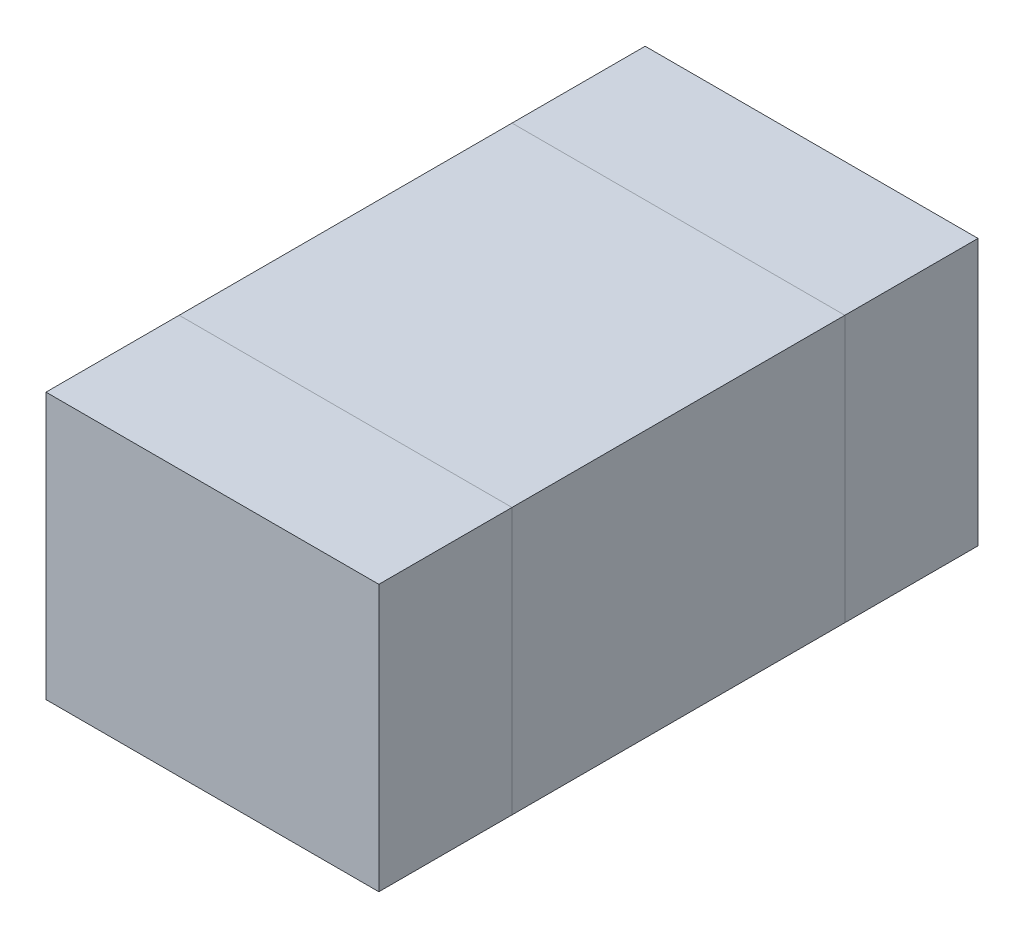
ISO-10303-21;
HEADER;
FILE_DESCRIPTION(('STEP AP214'),'2;1');
FILE_NAME('part.step','',(''),(''),'','','');
FILE_SCHEMA(('AUTOMOTIVE_DESIGN { 1 0 10303 214 1 1 1 1 }'));
ENDSEC;
DATA;
#1=APPLICATION_CONTEXT('core data for automotive mechanical design processes');
#2=APPLICATION_PROTOCOL_DEFINITION('international standard','automotive_design',2000,#1);
#3=PRODUCT_CONTEXT('',#1,'mechanical');
#4=PRODUCT('Part','Part','',(#3));
#5=PRODUCT_RELATED_PRODUCT_CATEGORY('part','',(#4));
#6=PRODUCT_DEFINITION_FORMATION('','',#4);
#7=PRODUCT_DEFINITION_CONTEXT('part definition',#1,'design');
#8=PRODUCT_DEFINITION('design','',#6,#7);
#9=PRODUCT_DEFINITION_SHAPE('','',#8);
#10=(LENGTH_UNIT() NAMED_UNIT(*) SI_UNIT(.MILLI.,.METRE.));
#11=(NAMED_UNIT(*) PLANE_ANGLE_UNIT() SI_UNIT($,.RADIAN.));
#12=(NAMED_UNIT(*) SI_UNIT($,.STERADIAN.) SOLID_ANGLE_UNIT());
#13=UNCERTAINTY_MEASURE_WITH_UNIT(LENGTH_MEASURE(1.E-05),#10,'distance_accuracy_value','');
#14=(GEOMETRIC_REPRESENTATION_CONTEXT(3) GLOBAL_UNCERTAINTY_ASSIGNED_CONTEXT((#13)) GLOBAL_UNIT_ASSIGNED_CONTEXT((#10,
#11,#12)) REPRESENTATION_CONTEXT('',''));
#15=CARTESIAN_POINT('',(0.,0.,0.));
#16=DIRECTION('',(0.,0.,1.));
#17=DIRECTION('',(1.,0.,0.));
#18=AXIS2_PLACEMENT_3D('',#15,#16,#17);
#19=CARTESIAN_POINT('',(0.,0.,0.));
#20=DIRECTION('',(0.,1.,0.));
#21=DIRECTION('',(1.,0.,0.));
#22=AXIS2_PLACEMENT_3D('',#19,#20,#21);
#23=PLANE('',#22);
#24=DIRECTION('',(0.,0.,-1.));
#25=VECTOR('',#24,1.);
#26=CARTESIAN_POINT('',(0.5,0.,-0.5));
#27=LINE('',#26,#25);
#28=CARTESIAN_POINT('',(0.5,0.,0.5));
#29=VERTEX_POINT('',#28);
#30=CARTESIAN_POINT('',(0.5,0.,-0.5));
#31=VERTEX_POINT('',#30);
#32=EDGE_CURVE('P0_E20',#29,#31,#27,.T.);
#33=ORIENTED_EDGE('',*,*,#32,.F.);
#34=DIRECTION('',(1.,0.,0.));
#35=VECTOR('',#34,1.);
#36=CARTESIAN_POINT('',(-0.5,0.,0.5));
#37=LINE('',#36,#35);
#38=CARTESIAN_POINT('',(-0.5,0.,0.5));
#39=VERTEX_POINT('',#38);
#40=EDGE_CURVE('P0_E27',#39,#29,#37,.T.);
#41=ORIENTED_EDGE('',*,*,#40,.F.);
#42=DIRECTION('',(0.,0.,1.));
#43=VECTOR('',#42,1.);
#44=CARTESIAN_POINT('',(-0.5,0.,-0.5));
#45=LINE('',#44,#43);
#46=CARTESIAN_POINT('',(-0.5,0.,-0.5));
#47=VERTEX_POINT('',#46);
#48=EDGE_CURVE('P0_E91',#47,#39,#45,.T.);
#49=ORIENTED_EDGE('',*,*,#48,.F.);
#50=DIRECTION('',(-1.,0.,0.));
#51=VECTOR('',#50,1.);
#52=CARTESIAN_POINT('',(-0.5,0.,-0.5));
#53=LINE('',#52,#51);
#54=EDGE_CURVE('P0_E93',#31,#47,#53,.T.);
#55=ORIENTED_EDGE('',*,*,#54,.F.);
#56=EDGE_LOOP('',(#33,#41,#49,#55));
#57=FACE_BOUND('',#56,.T.);
#58=ADVANCED_FACE('P0_F16',(#57),#23,.F.);
#59=CARTESIAN_POINT('',(0.,0.8,0.));
#60=DIRECTION('',(0.,1.,0.));
#61=DIRECTION('',(1.,0.,0.));
#62=AXIS2_PLACEMENT_3D('',#59,#60,#61);
#63=PLANE('',#62);
#64=DIRECTION('',(0.,0.,-1.));
#65=VECTOR('',#64,1.);
#66=CARTESIAN_POINT('',(0.5,0.8,-0.5));
#67=LINE('',#66,#65);
#68=CARTESIAN_POINT('',(0.5,0.8,0.5));
#69=VERTEX_POINT('',#68);
#70=CARTESIAN_POINT('',(0.5,0.8,-0.5));
#71=VERTEX_POINT('',#70);
#72=EDGE_CURVE('P0_E88',#69,#71,#67,.T.);
#73=ORIENTED_EDGE('',*,*,#72,.T.);
#74=DIRECTION('',(-1.,0.,0.));
#75=VECTOR('',#74,1.);
#76=CARTESIAN_POINT('',(-0.5,0.8,-0.5));
#77=LINE('',#76,#75);
#78=CARTESIAN_POINT('',(-0.5,0.8,-0.5));
#79=VERTEX_POINT('',#78);
#80=EDGE_CURVE('P0_E69',#71,#79,#77,.T.);
#81=ORIENTED_EDGE('',*,*,#80,.T.);
#82=DIRECTION('',(0.,0.,1.));
#83=VECTOR('',#82,1.);
#84=CARTESIAN_POINT('',(-0.5,0.8,-0.5));
#85=LINE('',#84,#83);
#86=CARTESIAN_POINT('',(-0.5,0.8,0.5));
#87=VERTEX_POINT('',#86);
#88=EDGE_CURVE('P0_E78',#79,#87,#85,.T.);
#89=ORIENTED_EDGE('',*,*,#88,.T.);
#90=DIRECTION('',(1.,0.,0.));
#91=VECTOR('',#90,1.);
#92=CARTESIAN_POINT('',(-0.5,0.8,0.5));
#93=LINE('',#92,#91);
#94=EDGE_CURVE('P0_E11',#87,#69,#93,.T.);
#95=ORIENTED_EDGE('',*,*,#94,.T.);
#96=EDGE_LOOP('',(#73,#81,#89,#95));
#97=FACE_BOUND('',#96,.T.);
#98=ADVANCED_FACE('P0_F86',(#97),#63,.T.);
#99=CARTESIAN_POINT('',(-0.5,0.8,0.5));
#100=DIRECTION('',(0.,0.,-1.));
#101=DIRECTION('',(0.,-1.,0.));
#102=AXIS2_PLACEMENT_3D('',#99,#100,#101);
#103=PLANE('',#102);
#104=ORIENTED_EDGE('',*,*,#40,.T.);
#105=DIRECTION('',(0.,-1.,0.));
#106=VECTOR('',#105,1.);
#107=CARTESIAN_POINT('',(0.5,0.8,0.5));
#108=LINE('',#107,#106);
#109=EDGE_CURVE('P0_E100',#69,#29,#108,.T.);
#110=ORIENTED_EDGE('',*,*,#109,.F.);
#111=ORIENTED_EDGE('',*,*,#94,.F.);
#112=DIRECTION('',(0.,-1.,0.));
#113=VECTOR('',#112,1.);
#114=CARTESIAN_POINT('',(-0.5,0.8,0.5));
#115=LINE('',#114,#113);
#116=EDGE_CURVE('P0_E83',#87,#39,#115,.T.);
#117=ORIENTED_EDGE('',*,*,#116,.T.);
#118=EDGE_LOOP('',(#104,#110,#111,#117));
#119=FACE_BOUND('',#118,.T.);
#120=ADVANCED_FACE('P0_F152',(#119),#103,.F.);
#121=CARTESIAN_POINT('',(-0.5,0.8,-0.5));
#122=DIRECTION('',(1.,0.,0.));
#123=DIRECTION('',(0.,0.,-1.));
#124=AXIS2_PLACEMENT_3D('',#121,#122,#123);
#125=PLANE('',#124);
#126=ORIENTED_EDGE('',*,*,#48,.T.);
#127=ORIENTED_EDGE('',*,*,#116,.F.);
#128=ORIENTED_EDGE('',*,*,#88,.F.);
#129=DIRECTION('',(0.,-1.,0.));
#130=VECTOR('',#129,1.);
#131=CARTESIAN_POINT('',(-0.5,0.8,-0.5));
#132=LINE('',#131,#130);
#133=EDGE_CURVE('P0_E81',#79,#47,#132,.T.);
#134=ORIENTED_EDGE('',*,*,#133,.T.);
#135=EDGE_LOOP('',(#126,#127,#128,#134));
#136=FACE_BOUND('',#135,.T.);
#137=ADVANCED_FACE('P0_F80',(#136),#125,.F.);
#138=CARTESIAN_POINT('',(-0.5,0.8,-0.5));
#139=DIRECTION('',(0.,0.,1.));
#140=DIRECTION('',(1.,0.,0.));
#141=AXIS2_PLACEMENT_3D('',#138,#139,#140);
#142=PLANE('',#141);
#143=ORIENTED_EDGE('',*,*,#54,.T.);
#144=ORIENTED_EDGE('',*,*,#133,.F.);
#145=ORIENTED_EDGE('',*,*,#80,.F.);
#146=DIRECTION('',(0.,-1.,0.));
#147=VECTOR('',#146,1.);
#148=CARTESIAN_POINT('',(0.5,0.8,-0.5));
#149=LINE('',#148,#147);
#150=EDGE_CURVE('P0_E108',#71,#31,#149,.T.);
#151=ORIENTED_EDGE('',*,*,#150,.T.);
#152=EDGE_LOOP('',(#143,#144,#145,#151));
#153=FACE_BOUND('',#152,.T.);
#154=ADVANCED_FACE('P0_F18',(#153),#142,.F.);
#155=CARTESIAN_POINT('',(0.5,0.8,-0.5));
#156=DIRECTION('',(-1.,0.,0.));
#157=DIRECTION('',(0.,1.,0.));
#158=AXIS2_PLACEMENT_3D('',#155,#156,#157);
#159=PLANE('',#158);
#160=ORIENTED_EDGE('',*,*,#32,.T.);
#161=ORIENTED_EDGE('',*,*,#150,.F.);
#162=ORIENTED_EDGE('',*,*,#72,.F.);
#163=ORIENTED_EDGE('',*,*,#109,.T.);
#164=EDGE_LOOP('',(#160,#161,#162,#163));
#165=FACE_BOUND('',#164,.T.);
#166=ADVANCED_FACE('P0_F162',(#165),#159,.F.);
#167=CLOSED_SHELL('',(#58,#98,#120,#137,#154,#166));
#168=MANIFOLD_SOLID_BREP('P0_B1',#167);
#169=CARTESIAN_POINT('',(-0.5,1.8770329614269,0.5));
#170=DIRECTION('',(-1.,0.,0.));
#171=DIRECTION('',(0.,1.,0.));
#172=AXIS2_PLACEMENT_3D('',#169,#170,#171);
#173=PLANE('',#172);
#174=DIRECTION('',(0.,-1.,0.));
#175=VECTOR('',#174,1.);
#176=CARTESIAN_POINT('',(-0.5,1.8770329614269,0.9));
#177=LINE('',#176,#175);
#178=CARTESIAN_POINT('',(-0.5,0.8,0.9));
#179=VERTEX_POINT('',#178);
#180=CARTESIAN_POINT('',(-0.5,0.,0.9));
#181=VERTEX_POINT('',#180);
#182=EDGE_CURVE('P1_E11',#179,#181,#177,.T.);
#183=ORIENTED_EDGE('',*,*,#182,.F.);
#184=DIRECTION('',(0.,0.,-1.));
#185=VECTOR('',#184,1.);
#186=CARTESIAN_POINT('',(-0.5,0.8,0.5));
#187=LINE('',#186,#185);
#188=CARTESIAN_POINT('',(-0.5,0.8,0.5));
#189=VERTEX_POINT('',#188);
#190=EDGE_CURVE('P1_E73',#179,#189,#187,.T.);
#191=ORIENTED_EDGE('',*,*,#190,.T.);
#192=DIRECTION('',(0.,-1.,0.));
#193=VECTOR('',#192,1.);
#194=CARTESIAN_POINT('',(-0.5,1.8770329614269,0.5));
#195=LINE('',#194,#193);
#196=CARTESIAN_POINT('',(-0.5,0.,0.5));
#197=VERTEX_POINT('',#196);
#198=EDGE_CURVE('P1_E68',#189,#197,#195,.T.);
#199=ORIENTED_EDGE('',*,*,#198,.T.);
#200=DIRECTION('',(0.,0.,-1.));
#201=VECTOR('',#200,1.);
#202=CARTESIAN_POINT('',(-0.5,0.,0.5));
#203=LINE('',#202,#201);
#204=EDGE_CURVE('P1_E71',#181,#197,#203,.T.);
#205=ORIENTED_EDGE('',*,*,#204,.F.);
#206=EDGE_LOOP('',(#183,#191,#199,#205));
#207=FACE_BOUND('',#206,.T.);
#208=ADVANCED_FACE('P1_F16',(#207),#173,.T.);
#209=CARTESIAN_POINT('',(-0.5,1.8770329614269,0.9));
#210=DIRECTION('',(0.,0.,1.));
#211=DIRECTION('',(1.,0.,0.));
#212=AXIS2_PLACEMENT_3D('',#209,#210,#211);
#213=PLANE('',#212);
#214=DIRECTION('',(0.,-1.,0.));
#215=VECTOR('',#214,1.);
#216=CARTESIAN_POINT('',(0.5,1.8770329614269,0.9));
#217=LINE('',#216,#215);
#218=CARTESIAN_POINT('',(0.5,0.8,0.9));
#219=VERTEX_POINT('',#218);
#220=CARTESIAN_POINT('',(0.5,0.,0.9));
#221=VERTEX_POINT('',#220);
#222=EDGE_CURVE('P1_E26',#219,#221,#217,.T.);
#223=ORIENTED_EDGE('',*,*,#222,.F.);
#224=DIRECTION('',(-1.,0.,0.));
#225=VECTOR('',#224,1.);
#226=CARTESIAN_POINT('',(-0.5,0.8,0.9));
#227=LINE('',#226,#225);
#228=EDGE_CURVE('P1_E101',#219,#179,#227,.T.);
#229=ORIENTED_EDGE('',*,*,#228,.T.);
#230=ORIENTED_EDGE('',*,*,#182,.T.);
#231=DIRECTION('',(-1.,0.,0.));
#232=VECTOR('',#231,1.);
#233=CARTESIAN_POINT('',(-0.5,0.,0.9));
#234=LINE('',#233,#232);
#235=EDGE_CURVE('P1_E79',#221,#181,#234,.T.);
#236=ORIENTED_EDGE('',*,*,#235,.F.);
#237=EDGE_LOOP('',(#223,#229,#230,#236));
#238=FACE_BOUND('',#237,.T.);
#239=ADVANCED_FACE('P1_F136',(#238),#213,.T.);
#240=CARTESIAN_POINT('',(0.5,1.8770329614269,0.5));
#241=DIRECTION('',(1.,0.,0.));
#242=DIRECTION('',(0.,1.,0.));
#243=AXIS2_PLACEMENT_3D('',#240,#241,#242);
#244=PLANE('',#243);
#245=DIRECTION('',(0.,-1.,0.));
#246=VECTOR('',#245,1.);
#247=CARTESIAN_POINT('',(0.5,1.8770329614269,0.5));
#248=LINE('',#247,#246);
#249=CARTESIAN_POINT('',(0.5,0.8,0.5));
#250=VERTEX_POINT('',#249);
#251=CARTESIAN_POINT('',(0.5,0.,0.5));
#252=VERTEX_POINT('',#251);
#253=EDGE_CURVE('P1_E78',#250,#252,#248,.T.);
#254=ORIENTED_EDGE('',*,*,#253,.F.);
#255=DIRECTION('',(0.,0.,1.));
#256=VECTOR('',#255,1.);
#257=CARTESIAN_POINT('',(0.5,0.8,0.5));
#258=LINE('',#257,#256);
#259=EDGE_CURVE('P1_E96',#250,#219,#258,.T.);
#260=ORIENTED_EDGE('',*,*,#259,.T.);
#261=ORIENTED_EDGE('',*,*,#222,.T.);
#262=DIRECTION('',(0.,0.,1.));
#263=VECTOR('',#262,1.);
#264=CARTESIAN_POINT('',(0.5,0.,0.5));
#265=LINE('',#264,#263);
#266=EDGE_CURVE('P1_E86',#252,#221,#265,.T.);
#267=ORIENTED_EDGE('',*,*,#266,.F.);
#268=EDGE_LOOP('',(#254,#260,#261,#267));
#269=FACE_BOUND('',#268,.T.);
#270=ADVANCED_FACE('P1_F141',(#269),#244,.T.);
#271=CARTESIAN_POINT('',(-0.5,1.8770329614269,0.5));
#272=DIRECTION('',(0.,0.,-1.));
#273=DIRECTION('',(0.,-1.,0.));
#274=AXIS2_PLACEMENT_3D('',#271,#272,#273);
#275=PLANE('',#274);
#276=ORIENTED_EDGE('',*,*,#198,.F.);
#277=DIRECTION('',(1.,0.,0.));
#278=VECTOR('',#277,1.);
#279=CARTESIAN_POINT('',(-0.5,0.8,0.5));
#280=LINE('',#279,#278);
#281=EDGE_CURVE('P1_E90',#189,#250,#280,.T.);
#282=ORIENTED_EDGE('',*,*,#281,.T.);
#283=ORIENTED_EDGE('',*,*,#253,.T.);
#284=DIRECTION('',(1.,0.,0.));
#285=VECTOR('',#284,1.);
#286=CARTESIAN_POINT('',(-0.5,0.,0.5));
#287=LINE('',#286,#285);
#288=EDGE_CURVE('P1_E19',#197,#252,#287,.T.);
#289=ORIENTED_EDGE('',*,*,#288,.F.);
#290=EDGE_LOOP('',(#276,#282,#283,#289));
#291=FACE_BOUND('',#290,.T.);
#292=ADVANCED_FACE('P1_F82',(#291),#275,.T.);
#293=CARTESIAN_POINT('',(0.,0.,0.));
#294=DIRECTION('',(0.,1.,0.));
#295=DIRECTION('',(1.,0.,0.));
#296=AXIS2_PLACEMENT_3D('',#293,#294,#295);
#297=PLANE('',#296);
#298=ORIENTED_EDGE('',*,*,#204,.T.);
#299=ORIENTED_EDGE('',*,*,#288,.T.);
#300=ORIENTED_EDGE('',*,*,#266,.T.);
#301=ORIENTED_EDGE('',*,*,#235,.T.);
#302=EDGE_LOOP('',(#298,#299,#300,#301));
#303=FACE_BOUND('',#302,.T.);
#304=ADVANCED_FACE('P1_F88',(#303),#297,.F.);
#305=CARTESIAN_POINT('',(0.,0.8,0.));
#306=DIRECTION('',(0.,1.,0.));
#307=DIRECTION('',(1.,0.,0.));
#308=AXIS2_PLACEMENT_3D('',#305,#306,#307);
#309=PLANE('',#308);
#310=ORIENTED_EDGE('',*,*,#190,.F.);
#311=ORIENTED_EDGE('',*,*,#228,.F.);
#312=ORIENTED_EDGE('',*,*,#259,.F.);
#313=ORIENTED_EDGE('',*,*,#281,.F.);
#314=EDGE_LOOP('',(#310,#311,#312,#313));
#315=FACE_BOUND('',#314,.T.);
#316=ADVANCED_FACE('P1_F150',(#315),#309,.T.);
#317=CLOSED_SHELL('',(#208,#239,#270,#292,#304,#316));
#318=MANIFOLD_SOLID_BREP('P1_B1',#317);
#319=CARTESIAN_POINT('',(-0.5,1.8770329614269,-0.5));
#320=DIRECTION('',(-1.,0.,0.));
#321=DIRECTION('',(0.,0.,1.));
#322=AXIS2_PLACEMENT_3D('',#319,#320,#321);
#323=PLANE('',#322);
#324=DIRECTION('',(0.,-1.,0.));
#325=VECTOR('',#324,1.);
#326=CARTESIAN_POINT('',(-0.5,1.8770329614269,-0.5));
#327=LINE('',#326,#325);
#328=CARTESIAN_POINT('',(-0.5,0.8,-0.5));
#329=VERTEX_POINT('',#328);
#330=CARTESIAN_POINT('',(-0.5,0.,-0.5));
#331=VERTEX_POINT('',#330);
#332=EDGE_CURVE('P2_E11',#329,#331,#327,.T.);
#333=ORIENTED_EDGE('',*,*,#332,.F.);
#334=DIRECTION('',(0.,0.,-1.));
#335=VECTOR('',#334,1.);
#336=CARTESIAN_POINT('',(-0.5,0.8,-0.5));
#337=LINE('',#336,#335);
#338=CARTESIAN_POINT('',(-0.5,0.8,-0.9));
#339=VERTEX_POINT('',#338);
#340=EDGE_CURVE('P2_E86',#329,#339,#337,.T.);
#341=ORIENTED_EDGE('',*,*,#340,.T.);
#342=DIRECTION('',(0.,-1.,0.));
#343=VECTOR('',#342,1.);
#344=CARTESIAN_POINT('',(-0.5,1.8770329614269,-0.9));
#345=LINE('',#344,#343);
#346=CARTESIAN_POINT('',(-0.5,0.,-0.9));
#347=VERTEX_POINT('',#346);
#348=EDGE_CURVE('P2_E68',#339,#347,#345,.T.);
#349=ORIENTED_EDGE('',*,*,#348,.T.);
#350=DIRECTION('',(0.,0.,-1.));
#351=VECTOR('',#350,1.);
#352=CARTESIAN_POINT('',(-0.5,0.,-0.5));
#353=LINE('',#352,#351);
#354=EDGE_CURVE('P2_E89',#331,#347,#353,.T.);
#355=ORIENTED_EDGE('',*,*,#354,.F.);
#356=EDGE_LOOP('',(#333,#341,#349,#355));
#357=FACE_BOUND('',#356,.T.);
#358=ADVANCED_FACE('P2_F16',(#357),#323,.T.);
#359=CARTESIAN_POINT('',(-0.5,1.8770329614269,-0.5));
#360=DIRECTION('',(0.,0.,1.));
#361=DIRECTION('',(1.,0.,0.));
#362=AXIS2_PLACEMENT_3D('',#359,#360,#361);
#363=PLANE('',#362);
#364=DIRECTION('',(0.,-1.,0.));
#365=VECTOR('',#364,1.);
#366=CARTESIAN_POINT('',(0.5,1.8770329614269,-0.5));
#367=LINE('',#366,#365);
#368=CARTESIAN_POINT('',(0.5,0.8,-0.5));
#369=VERTEX_POINT('',#368);
#370=CARTESIAN_POINT('',(0.5,0.,-0.5));
#371=VERTEX_POINT('',#370);
#372=EDGE_CURVE('P2_E27',#369,#371,#367,.T.);
#373=ORIENTED_EDGE('',*,*,#372,.F.);
#374=DIRECTION('',(-1.,0.,0.));
#375=VECTOR('',#374,1.);
#376=CARTESIAN_POINT('',(-0.5,0.8,-0.5));
#377=LINE('',#376,#375);
#378=EDGE_CURVE('P2_E93',#369,#329,#377,.T.);
#379=ORIENTED_EDGE('',*,*,#378,.T.);
#380=ORIENTED_EDGE('',*,*,#332,.T.);
#381=DIRECTION('',(-1.,0.,0.));
#382=VECTOR('',#381,1.);
#383=CARTESIAN_POINT('',(-0.5,0.,-0.5));
#384=LINE('',#383,#382);
#385=EDGE_CURVE('P2_E80',#371,#331,#384,.T.);
#386=ORIENTED_EDGE('',*,*,#385,.F.);
#387=EDGE_LOOP('',(#373,#379,#380,#386));
#388=FACE_BOUND('',#387,.T.);
#389=ADVANCED_FACE('P2_F125',(#388),#363,.T.);
#390=CARTESIAN_POINT('',(0.5,1.8770329614269,-0.5));
#391=DIRECTION('',(1.,0.,0.));
#392=DIRECTION('',(0.,0.,1.));
#393=AXIS2_PLACEMENT_3D('',#390,#391,#392);
#394=PLANE('',#393);
#395=DIRECTION('',(0.,-1.,0.));
#396=VECTOR('',#395,1.);
#397=CARTESIAN_POINT('',(0.5,1.8770329614269,-0.9));
#398=LINE('',#397,#396);
#399=CARTESIAN_POINT('',(0.5,0.8,-0.9));
#400=VERTEX_POINT('',#399);
#401=CARTESIAN_POINT('',(0.5,0.,-0.9));
#402=VERTEX_POINT('',#401);
#403=EDGE_CURVE('P2_E20',#400,#402,#398,.T.);
#404=ORIENTED_EDGE('',*,*,#403,.F.);
#405=DIRECTION('',(0.,0.,1.));
#406=VECTOR('',#405,1.);
#407=CARTESIAN_POINT('',(0.5,0.8,-0.5));
#408=LINE('',#407,#406);
#409=EDGE_CURVE('P2_E87',#400,#369,#408,.T.);
#410=ORIENTED_EDGE('',*,*,#409,.T.);
#411=ORIENTED_EDGE('',*,*,#372,.T.);
#412=DIRECTION('',(0.,0.,1.));
#413=VECTOR('',#412,1.);
#414=CARTESIAN_POINT('',(0.5,0.,-0.5));
#415=LINE('',#414,#413);
#416=EDGE_CURVE('P2_E104',#402,#371,#415,.T.);
#417=ORIENTED_EDGE('',*,*,#416,.F.);
#418=EDGE_LOOP('',(#404,#410,#411,#417));
#419=FACE_BOUND('',#418,.T.);
#420=ADVANCED_FACE('P2_F18',(#419),#394,.T.);
#421=CARTESIAN_POINT('',(-0.5,1.8770329614269,-0.9));
#422=DIRECTION('',(0.,0.,-1.));
#423=DIRECTION('',(0.,-1.,0.));
#424=AXIS2_PLACEMENT_3D('',#421,#422,#423);
#425=PLANE('',#424);
#426=ORIENTED_EDGE('',*,*,#348,.F.);
#427=DIRECTION('',(1.,0.,0.));
#428=VECTOR('',#427,1.);
#429=CARTESIAN_POINT('',(-0.5,0.8,-0.9));
#430=LINE('',#429,#428);
#431=EDGE_CURVE('P2_E71',#339,#400,#430,.T.);
#432=ORIENTED_EDGE('',*,*,#431,.T.);
#433=ORIENTED_EDGE('',*,*,#403,.T.);
#434=DIRECTION('',(1.,0.,0.));
#435=VECTOR('',#434,1.);
#436=CARTESIAN_POINT('',(-0.5,0.,-0.9));
#437=LINE('',#436,#435);
#438=EDGE_CURVE('P2_E74',#347,#402,#437,.T.);
#439=ORIENTED_EDGE('',*,*,#438,.F.);
#440=EDGE_LOOP('',(#426,#432,#433,#439));
#441=FACE_BOUND('',#440,.T.);
#442=ADVANCED_FACE('P2_F70',(#441),#425,.T.);
#443=CARTESIAN_POINT('',(0.,0.,0.));
#444=DIRECTION('',(0.,-1.,0.));
#445=DIRECTION('',(0.,0.,-1.));
#446=AXIS2_PLACEMENT_3D('',#443,#444,#445);
#447=PLANE('',#446);
#448=ORIENTED_EDGE('',*,*,#354,.T.);
#449=ORIENTED_EDGE('',*,*,#438,.T.);
#450=ORIENTED_EDGE('',*,*,#416,.T.);
#451=ORIENTED_EDGE('',*,*,#385,.T.);
#452=EDGE_LOOP('',(#448,#449,#450,#451));
#453=FACE_BOUND('',#452,.T.);
#454=ADVANCED_FACE('P2_F119',(#453),#447,.T.);
#455=CARTESIAN_POINT('',(0.,0.8,0.));
#456=DIRECTION('',(0.,1.,0.));
#457=DIRECTION('',(1.,0.,0.));
#458=AXIS2_PLACEMENT_3D('',#455,#456,#457);
#459=PLANE('',#458);
#460=ORIENTED_EDGE('',*,*,#340,.F.);
#461=ORIENTED_EDGE('',*,*,#378,.F.);
#462=ORIENTED_EDGE('',*,*,#409,.F.);
#463=ORIENTED_EDGE('',*,*,#431,.F.);
#464=EDGE_LOOP('',(#460,#461,#462,#463));
#465=FACE_BOUND('',#464,.T.);
#466=ADVANCED_FACE('P2_F84',(#465),#459,.T.);
#467=CLOSED_SHELL('',(#358,#389,#420,#442,#454,#466));
#468=MANIFOLD_SOLID_BREP('P2_B1',#467);
#469=ADVANCED_BREP_SHAPE_REPRESENTATION('',(#18,#168,#318,#468),#14);
#470=SHAPE_DEFINITION_REPRESENTATION(#9,#469);
ENDSEC;
END-ISO-10303-21;
